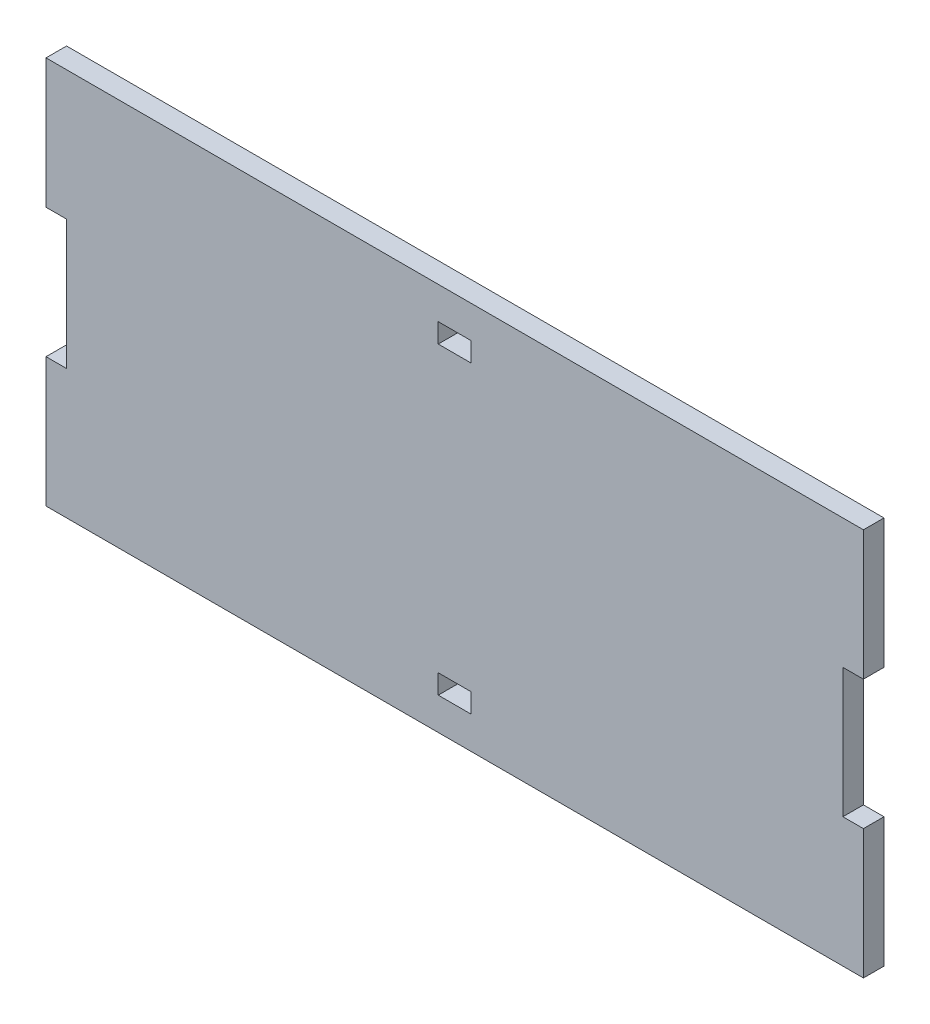
ISO-10303-21;
HEADER;
FILE_DESCRIPTION(('STEP AP214'),'2;1');
FILE_NAME('part.step','',(''),(''),'','','');
FILE_SCHEMA(('AUTOMOTIVE_DESIGN { 1 0 10303 214 1 1 1 1 }'));
ENDSEC;
DATA;
#1=APPLICATION_CONTEXT('core data for automotive mechanical design processes');
#2=APPLICATION_PROTOCOL_DEFINITION('international standard','automotive_design',2000,#1);
#3=PRODUCT_CONTEXT('',#1,'mechanical');
#4=PRODUCT('Part','Part','',(#3));
#5=PRODUCT_RELATED_PRODUCT_CATEGORY('part','',(#4));
#6=PRODUCT_DEFINITION_FORMATION('','',#4);
#7=PRODUCT_DEFINITION_CONTEXT('part definition',#1,'design');
#8=PRODUCT_DEFINITION('design','',#6,#7);
#9=PRODUCT_DEFINITION_SHAPE('','',#8);
#10=(LENGTH_UNIT() NAMED_UNIT(*) SI_UNIT(.MILLI.,.METRE.));
#11=(NAMED_UNIT(*) PLANE_ANGLE_UNIT() SI_UNIT($,.RADIAN.));
#12=(NAMED_UNIT(*) SI_UNIT($,.STERADIAN.) SOLID_ANGLE_UNIT());
#13=UNCERTAINTY_MEASURE_WITH_UNIT(LENGTH_MEASURE(1.E-05),#10,'distance_accuracy_value','');
#14=(GEOMETRIC_REPRESENTATION_CONTEXT(3) GLOBAL_UNCERTAINTY_ASSIGNED_CONTEXT((#13)) GLOBAL_UNIT_ASSIGNED_CONTEXT((#10,
#11,#12)) REPRESENTATION_CONTEXT('',''));
#15=CARTESIAN_POINT('',(0.,0.,0.));
#16=DIRECTION('',(0.,0.,1.));
#17=DIRECTION('',(1.,0.,0.));
#18=AXIS2_PLACEMENT_3D('',#15,#16,#17);
#19=CARTESIAN_POINT('',(0.,0.,3.175));
#20=DIRECTION('',(0.,0.,1.));
#21=DIRECTION('',(1.,0.,0.));
#22=AXIS2_PLACEMENT_3D('',#19,#20,#21);
#23=PLANE('',#22);
#24=DIRECTION('',(0.,-1.,0.));
#25=VECTOR('',#24,1.);
#26=CARTESIAN_POINT('',(0.,0.,3.175));
#27=LINE('',#26,#25);
#28=CARTESIAN_POINT('',(0.,20.,3.175));
#29=VERTEX_POINT('',#28);
#30=CARTESIAN_POINT('',(0.,0.,3.175));
#31=VERTEX_POINT('',#30);
#32=EDGE_CURVE('E237',#29,#31,#27,.T.);
#33=ORIENTED_EDGE('',*,*,#32,.T.);
#34=DIRECTION('',(1.,0.,0.));
#35=VECTOR('',#34,1.);
#36=CARTESIAN_POINT('',(0.,0.,3.175));
#37=LINE('',#36,#35);
#38=CARTESIAN_POINT('',(126.35,0.,3.175));
#39=VERTEX_POINT('',#38);
#40=EDGE_CURVE('E240',#31,#39,#37,.T.);
#41=ORIENTED_EDGE('',*,*,#40,.T.);
#42=DIRECTION('',(0.,1.,0.));
#43=VECTOR('',#42,1.);
#44=CARTESIAN_POINT('',(126.35,0.,3.175));
#45=LINE('',#44,#43);
#46=CARTESIAN_POINT('',(126.35,20.,3.175));
#47=VERTEX_POINT('',#46);
#48=EDGE_CURVE('E243',#39,#47,#45,.T.);
#49=ORIENTED_EDGE('',*,*,#48,.T.);
#50=DIRECTION('',(-1.,0.,0.));
#51=VECTOR('',#50,1.);
#52=CARTESIAN_POINT('',(123.175,20.,3.175));
#53=LINE('',#52,#51);
#54=CARTESIAN_POINT('',(123.175,20.,3.175));
#55=VERTEX_POINT('',#54);
#56=EDGE_CURVE('E245',#47,#55,#53,.T.);
#57=ORIENTED_EDGE('',*,*,#56,.T.);
#58=DIRECTION('',(0.,1.,0.));
#59=VECTOR('',#58,1.);
#60=CARTESIAN_POINT('',(123.175,40.,3.175));
#61=LINE('',#60,#59);
#62=CARTESIAN_POINT('',(123.175,40.,3.175));
#63=VERTEX_POINT('',#62);
#64=EDGE_CURVE('E247',#55,#63,#61,.T.);
#65=ORIENTED_EDGE('',*,*,#64,.T.);
#66=DIRECTION('',(1.,0.,0.));
#67=VECTOR('',#66,1.);
#68=CARTESIAN_POINT('',(126.35,40.,3.175));
#69=LINE('',#68,#67);
#70=CARTESIAN_POINT('',(126.35,40.,3.175));
#71=VERTEX_POINT('',#70);
#72=EDGE_CURVE('E249',#63,#71,#69,.T.);
#73=ORIENTED_EDGE('',*,*,#72,.T.);
#74=DIRECTION('',(0.,1.,0.));
#75=VECTOR('',#74,1.);
#76=CARTESIAN_POINT('',(126.35,40.,3.175));
#77=LINE('',#76,#75);
#78=CARTESIAN_POINT('',(126.35,60.,3.175));
#79=VERTEX_POINT('',#78);
#80=EDGE_CURVE('E251',#71,#79,#77,.T.);
#81=ORIENTED_EDGE('',*,*,#80,.T.);
#82=DIRECTION('',(-1.,0.,0.));
#83=VECTOR('',#82,1.);
#84=CARTESIAN_POINT('',(0.,60.,3.175));
#85=LINE('',#84,#83);
#86=CARTESIAN_POINT('',(0.,60.,3.175));
#87=VERTEX_POINT('',#86);
#88=EDGE_CURVE('E253',#79,#87,#85,.T.);
#89=ORIENTED_EDGE('',*,*,#88,.T.);
#90=DIRECTION('',(0.,-1.,0.));
#91=VECTOR('',#90,1.);
#92=CARTESIAN_POINT('',(0.,40.,3.175));
#93=LINE('',#92,#91);
#94=CARTESIAN_POINT('',(0.,40.,3.175));
#95=VERTEX_POINT('',#94);
#96=EDGE_CURVE('E255',#87,#95,#93,.T.);
#97=ORIENTED_EDGE('',*,*,#96,.T.);
#98=DIRECTION('',(1.,0.,0.));
#99=VECTOR('',#98,1.);
#100=CARTESIAN_POINT('',(0.,40.,3.175));
#101=LINE('',#100,#99);
#102=CARTESIAN_POINT('',(3.175,40.,3.175));
#103=VERTEX_POINT('',#102);
#104=EDGE_CURVE('E257',#95,#103,#101,.T.);
#105=ORIENTED_EDGE('',*,*,#104,.T.);
#106=DIRECTION('',(0.,-1.,0.));
#107=VECTOR('',#106,1.);
#108=CARTESIAN_POINT('',(3.175,40.,3.175));
#109=LINE('',#108,#107);
#110=CARTESIAN_POINT('',(3.175,20.,3.175));
#111=VERTEX_POINT('',#110);
#112=EDGE_CURVE('E259',#103,#111,#109,.T.);
#113=ORIENTED_EDGE('',*,*,#112,.T.);
#114=DIRECTION('',(-1.,0.,0.));
#115=VECTOR('',#114,1.);
#116=CARTESIAN_POINT('',(3.175,20.,3.175));
#117=LINE('',#116,#115);
#118=EDGE_CURVE('E261',#111,#29,#117,.T.);
#119=ORIENTED_EDGE('',*,*,#118,.T.);
#120=EDGE_LOOP('',(#33,#41,#49,#57,#65,#73,#81,#89,#97,#105,#113,#119));
#121=FACE_BOUND('',#120,.T.);
#122=DIRECTION('',(-1.,0.,0.));
#123=VECTOR('',#122,1.);
#124=CARTESIAN_POINT('',(65.725,8.,3.175));
#125=LINE('',#124,#123);
#126=CARTESIAN_POINT('',(65.725,8.,3.175));
#127=VERTEX_POINT('',#126);
#128=CARTESIAN_POINT('',(60.625,8.,3.175));
#129=VERTEX_POINT('',#128);
#130=EDGE_CURVE('E208',#127,#129,#125,.T.);
#131=ORIENTED_EDGE('',*,*,#130,.F.);
#132=DIRECTION('',(0.,1.,0.));
#133=VECTOR('',#132,1.);
#134=CARTESIAN_POINT('',(65.725,8.,3.175));
#135=LINE('',#134,#133);
#136=CARTESIAN_POINT('',(65.725,5.,3.175));
#137=VERTEX_POINT('',#136);
#138=EDGE_CURVE('E206',#137,#127,#135,.T.);
#139=ORIENTED_EDGE('',*,*,#138,.F.);
#140=DIRECTION('',(1.,0.,0.));
#141=VECTOR('',#140,1.);
#142=CARTESIAN_POINT('',(65.725,5.,3.175));
#143=LINE('',#142,#141);
#144=CARTESIAN_POINT('',(60.625,5.,3.175));
#145=VERTEX_POINT('',#144);
#146=EDGE_CURVE('E214',#145,#137,#143,.T.);
#147=ORIENTED_EDGE('',*,*,#146,.F.);
#148=DIRECTION('',(0.,-1.,0.));
#149=VECTOR('',#148,1.);
#150=CARTESIAN_POINT('',(60.625,8.,3.175));
#151=LINE('',#150,#149);
#152=EDGE_CURVE('E211',#129,#145,#151,.T.);
#153=ORIENTED_EDGE('',*,*,#152,.F.);
#154=EDGE_LOOP('',(#131,#139,#147,#153));
#155=FACE_BOUND('',#154,.T.);
#156=DIRECTION('',(-1.,0.,0.));
#157=VECTOR('',#156,1.);
#158=CARTESIAN_POINT('',(65.725,55.,3.175));
#159=LINE('',#158,#157);
#160=CARTESIAN_POINT('',(65.725,55.,3.175));
#161=VERTEX_POINT('',#160);
#162=CARTESIAN_POINT('',(60.625,55.,3.175));
#163=VERTEX_POINT('',#162);
#164=EDGE_CURVE('E178',#161,#163,#159,.T.);
#165=ORIENTED_EDGE('',*,*,#164,.F.);
#166=DIRECTION('',(0.,1.,0.));
#167=VECTOR('',#166,1.);
#168=CARTESIAN_POINT('',(65.725,52.,3.175));
#169=LINE('',#168,#167);
#170=CARTESIAN_POINT('',(65.725,52.,3.175));
#171=VERTEX_POINT('',#170);
#172=EDGE_CURVE('E170',#171,#161,#169,.T.);
#173=ORIENTED_EDGE('',*,*,#172,.F.);
#174=DIRECTION('',(1.,0.,0.));
#175=VECTOR('',#174,1.);
#176=CARTESIAN_POINT('',(65.725,52.,3.175));
#177=LINE('',#176,#175);
#178=CARTESIAN_POINT('',(60.625,52.,3.175));
#179=VERTEX_POINT('',#178);
#180=EDGE_CURVE('E192',#179,#171,#177,.T.);
#181=ORIENTED_EDGE('',*,*,#180,.F.);
#182=DIRECTION('',(0.,-1.,0.));
#183=VECTOR('',#182,1.);
#184=CARTESIAN_POINT('',(60.625,52.,3.175));
#185=LINE('',#184,#183);
#186=EDGE_CURVE('E190',#163,#179,#185,.T.);
#187=ORIENTED_EDGE('',*,*,#186,.F.);
#188=EDGE_LOOP('',(#165,#173,#181,#187));
#189=FACE_BOUND('',#188,.T.);
#190=ADVANCED_FACE('F33',(#121,#155,#189),#23,.T.);
#191=CARTESIAN_POINT('',(0.,0.,0.));
#192=DIRECTION('',(0.,0.,1.));
#193=DIRECTION('',(1.,0.,0.));
#194=AXIS2_PLACEMENT_3D('',#191,#192,#193);
#195=PLANE('',#194);
#196=DIRECTION('',(0.,1.,0.));
#197=VECTOR('',#196,1.);
#198=CARTESIAN_POINT('',(65.725,8.,0.));
#199=LINE('',#198,#197);
#200=CARTESIAN_POINT('',(65.725,5.,0.));
#201=VERTEX_POINT('',#200);
#202=CARTESIAN_POINT('',(65.725,8.,0.));
#203=VERTEX_POINT('',#202);
#204=EDGE_CURVE('E186',#201,#203,#199,.T.);
#205=ORIENTED_EDGE('',*,*,#204,.T.);
#206=DIRECTION('',(-1.,0.,0.));
#207=VECTOR('',#206,1.);
#208=CARTESIAN_POINT('',(65.725,8.,0.));
#209=LINE('',#208,#207);
#210=CARTESIAN_POINT('',(60.625,8.,0.));
#211=VERTEX_POINT('',#210);
#212=EDGE_CURVE('E219',#203,#211,#209,.T.);
#213=ORIENTED_EDGE('',*,*,#212,.T.);
#214=DIRECTION('',(0.,-1.,0.));
#215=VECTOR('',#214,1.);
#216=CARTESIAN_POINT('',(60.625,8.,0.));
#217=LINE('',#216,#215);
#218=CARTESIAN_POINT('',(60.625,5.,0.));
#219=VERTEX_POINT('',#218);
#220=EDGE_CURVE('E222',#211,#219,#217,.T.);
#221=ORIENTED_EDGE('',*,*,#220,.T.);
#222=DIRECTION('',(1.,0.,0.));
#223=VECTOR('',#222,1.);
#224=CARTESIAN_POINT('',(65.725,5.,0.));
#225=LINE('',#224,#223);
#226=EDGE_CURVE('E209',#219,#201,#225,.T.);
#227=ORIENTED_EDGE('',*,*,#226,.T.);
#228=EDGE_LOOP('',(#205,#213,#221,#227));
#229=FACE_BOUND('',#228,.T.);
#230=DIRECTION('',(0.,-1.,0.));
#231=VECTOR('',#230,1.);
#232=CARTESIAN_POINT('',(0.,0.,0.));
#233=LINE('',#232,#231);
#234=CARTESIAN_POINT('',(0.,20.,0.));
#235=VERTEX_POINT('',#234);
#236=CARTESIAN_POINT('',(0.,0.,0.));
#237=VERTEX_POINT('',#236);
#238=EDGE_CURVE('E236',#235,#237,#233,.T.);
#239=ORIENTED_EDGE('',*,*,#238,.F.);
#240=DIRECTION('',(-1.,0.,0.));
#241=VECTOR('',#240,1.);
#242=CARTESIAN_POINT('',(3.175,20.,0.));
#243=LINE('',#242,#241);
#244=CARTESIAN_POINT('',(3.175,20.,0.));
#245=VERTEX_POINT('',#244);
#246=EDGE_CURVE('E241',#245,#235,#243,.T.);
#247=ORIENTED_EDGE('',*,*,#246,.F.);
#248=DIRECTION('',(0.,-1.,0.));
#249=VECTOR('',#248,1.);
#250=CARTESIAN_POINT('',(3.175,40.,0.));
#251=LINE('',#250,#249);
#252=CARTESIAN_POINT('',(3.175,40.,0.));
#253=VERTEX_POINT('',#252);
#254=EDGE_CURVE('E284',#253,#245,#251,.T.);
#255=ORIENTED_EDGE('',*,*,#254,.F.);
#256=DIRECTION('',(1.,0.,0.));
#257=VECTOR('',#256,1.);
#258=CARTESIAN_POINT('',(0.,40.,0.));
#259=LINE('',#258,#257);
#260=CARTESIAN_POINT('',(0.,40.,0.));
#261=VERTEX_POINT('',#260);
#262=EDGE_CURVE('E282',#261,#253,#259,.T.);
#263=ORIENTED_EDGE('',*,*,#262,.F.);
#264=DIRECTION('',(0.,-1.,0.));
#265=VECTOR('',#264,1.);
#266=CARTESIAN_POINT('',(0.,40.,0.));
#267=LINE('',#266,#265);
#268=CARTESIAN_POINT('',(0.,60.,0.));
#269=VERTEX_POINT('',#268);
#270=EDGE_CURVE('E280',#269,#261,#267,.T.);
#271=ORIENTED_EDGE('',*,*,#270,.F.);
#272=DIRECTION('',(-1.,0.,0.));
#273=VECTOR('',#272,1.);
#274=CARTESIAN_POINT('',(0.,60.,0.));
#275=LINE('',#274,#273);
#276=CARTESIAN_POINT('',(126.35,60.,0.));
#277=VERTEX_POINT('',#276);
#278=EDGE_CURVE('E278',#277,#269,#275,.T.);
#279=ORIENTED_EDGE('',*,*,#278,.F.);
#280=DIRECTION('',(0.,1.,0.));
#281=VECTOR('',#280,1.);
#282=CARTESIAN_POINT('',(126.35,40.,0.));
#283=LINE('',#282,#281);
#284=CARTESIAN_POINT('',(126.35,40.,0.));
#285=VERTEX_POINT('',#284);
#286=EDGE_CURVE('E276',#285,#277,#283,.T.);
#287=ORIENTED_EDGE('',*,*,#286,.F.);
#288=DIRECTION('',(1.,0.,0.));
#289=VECTOR('',#288,1.);
#290=CARTESIAN_POINT('',(126.35,40.,0.));
#291=LINE('',#290,#289);
#292=CARTESIAN_POINT('',(123.175,40.,0.));
#293=VERTEX_POINT('',#292);
#294=EDGE_CURVE('E274',#293,#285,#291,.T.);
#295=ORIENTED_EDGE('',*,*,#294,.F.);
#296=DIRECTION('',(0.,1.,0.));
#297=VECTOR('',#296,1.);
#298=CARTESIAN_POINT('',(123.175,40.,0.));
#299=LINE('',#298,#297);
#300=CARTESIAN_POINT('',(123.175,20.,0.));
#301=VERTEX_POINT('',#300);
#302=EDGE_CURVE('E272',#301,#293,#299,.T.);
#303=ORIENTED_EDGE('',*,*,#302,.F.);
#304=DIRECTION('',(-1.,0.,0.));
#305=VECTOR('',#304,1.);
#306=CARTESIAN_POINT('',(123.175,20.,0.));
#307=LINE('',#306,#305);
#308=CARTESIAN_POINT('',(126.35,20.,0.));
#309=VERTEX_POINT('',#308);
#310=EDGE_CURVE('E270',#309,#301,#307,.T.);
#311=ORIENTED_EDGE('',*,*,#310,.F.);
#312=DIRECTION('',(0.,1.,0.));
#313=VECTOR('',#312,1.);
#314=CARTESIAN_POINT('',(126.35,0.,0.));
#315=LINE('',#314,#313);
#316=CARTESIAN_POINT('',(126.35,0.,0.));
#317=VERTEX_POINT('',#316);
#318=EDGE_CURVE('E268',#317,#309,#315,.T.);
#319=ORIENTED_EDGE('',*,*,#318,.F.);
#320=DIRECTION('',(1.,0.,0.));
#321=VECTOR('',#320,1.);
#322=CARTESIAN_POINT('',(0.,0.,0.));
#323=LINE('',#322,#321);
#324=EDGE_CURVE('E266',#237,#317,#323,.T.);
#325=ORIENTED_EDGE('',*,*,#324,.F.);
#326=EDGE_LOOP('',(#239,#247,#255,#263,#271,#279,#287,#295,#303,#311,#319,#325));
#327=FACE_BOUND('',#326,.T.);
#328=DIRECTION('',(0.,1.,0.));
#329=VECTOR('',#328,1.);
#330=CARTESIAN_POINT('',(65.725,52.,0.));
#331=LINE('',#330,#329);
#332=CARTESIAN_POINT('',(65.725,52.,0.));
#333=VERTEX_POINT('',#332);
#334=CARTESIAN_POINT('',(65.725,55.,0.));
#335=VERTEX_POINT('',#334);
#336=EDGE_CURVE('E56',#333,#335,#331,.T.);
#337=ORIENTED_EDGE('',*,*,#336,.T.);
#338=DIRECTION('',(-1.,0.,0.));
#339=VECTOR('',#338,1.);
#340=CARTESIAN_POINT('',(65.725,55.,0.));
#341=LINE('',#340,#339);
#342=CARTESIAN_POINT('',(60.625,55.,0.));
#343=VERTEX_POINT('',#342);
#344=EDGE_CURVE('E185',#335,#343,#341,.T.);
#345=ORIENTED_EDGE('',*,*,#344,.T.);
#346=DIRECTION('',(0.,-1.,0.));
#347=VECTOR('',#346,1.);
#348=CARTESIAN_POINT('',(60.625,52.,0.));
#349=LINE('',#348,#347);
#350=CARTESIAN_POINT('',(60.625,52.,0.));
#351=VERTEX_POINT('',#350);
#352=EDGE_CURVE('E198',#343,#351,#349,.T.);
#353=ORIENTED_EDGE('',*,*,#352,.T.);
#354=DIRECTION('',(1.,0.,0.));
#355=VECTOR('',#354,1.);
#356=CARTESIAN_POINT('',(65.725,52.,0.));
#357=LINE('',#356,#355);
#358=EDGE_CURVE('E179',#351,#333,#357,.T.);
#359=ORIENTED_EDGE('',*,*,#358,.T.);
#360=EDGE_LOOP('',(#337,#345,#353,#359));
#361=FACE_BOUND('',#360,.T.);
#362=ADVANCED_FACE('F326',(#229,#327,#361),#195,.F.);
#363=CARTESIAN_POINT('',(0.,0.,3.175));
#364=DIRECTION('',(1.,0.,0.));
#365=DIRECTION('',(0.,0.,-1.));
#366=AXIS2_PLACEMENT_3D('',#363,#364,#365);
#367=PLANE('',#366);
#368=ORIENTED_EDGE('',*,*,#238,.T.);
#369=DIRECTION('',(0.,0.,-1.));
#370=VECTOR('',#369,1.);
#371=CARTESIAN_POINT('',(0.,0.,3.175));
#372=LINE('',#371,#370);
#373=EDGE_CURVE('E11',#31,#237,#372,.T.);
#374=ORIENTED_EDGE('',*,*,#373,.F.);
#375=ORIENTED_EDGE('',*,*,#32,.F.);
#376=DIRECTION('',(0.,0.,-1.));
#377=VECTOR('',#376,1.);
#378=CARTESIAN_POINT('',(0.,20.,3.175));
#379=LINE('',#378,#377);
#380=EDGE_CURVE('E263',#29,#235,#379,.T.);
#381=ORIENTED_EDGE('',*,*,#380,.T.);
#382=EDGE_LOOP('',(#368,#374,#375,#381));
#383=FACE_BOUND('',#382,.T.);
#384=ADVANCED_FACE('F35',(#383),#367,.F.);
#385=CARTESIAN_POINT('',(0.,0.,3.175));
#386=DIRECTION('',(0.,1.,0.));
#387=DIRECTION('',(0.,0.,1.));
#388=AXIS2_PLACEMENT_3D('',#385,#386,#387);
#389=PLANE('',#388);
#390=ORIENTED_EDGE('',*,*,#324,.T.);
#391=DIRECTION('',(0.,0.,-1.));
#392=VECTOR('',#391,1.);
#393=CARTESIAN_POINT('',(126.35,0.,3.175));
#394=LINE('',#393,#392);
#395=EDGE_CURVE('E41',#39,#317,#394,.T.);
#396=ORIENTED_EDGE('',*,*,#395,.F.);
#397=ORIENTED_EDGE('',*,*,#40,.F.);
#398=ORIENTED_EDGE('',*,*,#373,.T.);
#399=EDGE_LOOP('',(#390,#396,#397,#398));
#400=FACE_BOUND('',#399,.T.);
#401=ADVANCED_FACE('F344',(#400),#389,.F.);
#402=CARTESIAN_POINT('',(126.35,0.,3.175));
#403=DIRECTION('',(-1.,0.,0.));
#404=DIRECTION('',(0.,0.,1.));
#405=AXIS2_PLACEMENT_3D('',#402,#403,#404);
#406=PLANE('',#405);
#407=ORIENTED_EDGE('',*,*,#318,.T.);
#408=DIRECTION('',(0.,0.,-1.));
#409=VECTOR('',#408,1.);
#410=CARTESIAN_POINT('',(126.35,20.,3.175));
#411=LINE('',#410,#409);
#412=EDGE_CURVE('E313',#47,#309,#411,.T.);
#413=ORIENTED_EDGE('',*,*,#412,.F.);
#414=ORIENTED_EDGE('',*,*,#48,.F.);
#415=ORIENTED_EDGE('',*,*,#395,.T.);
#416=EDGE_LOOP('',(#407,#413,#414,#415));
#417=FACE_BOUND('',#416,.T.);
#418=ADVANCED_FACE('F320',(#417),#406,.F.);
#419=CARTESIAN_POINT('',(123.175,20.,3.175));
#420=DIRECTION('',(0.,-1.,0.));
#421=DIRECTION('',(0.,0.,-1.));
#422=AXIS2_PLACEMENT_3D('',#419,#420,#421);
#423=PLANE('',#422);
#424=ORIENTED_EDGE('',*,*,#310,.T.);
#425=DIRECTION('',(0.,0.,-1.));
#426=VECTOR('',#425,1.);
#427=CARTESIAN_POINT('',(123.175,20.,3.175));
#428=LINE('',#427,#426);
#429=EDGE_CURVE('E310',#55,#301,#428,.T.);
#430=ORIENTED_EDGE('',*,*,#429,.F.);
#431=ORIENTED_EDGE('',*,*,#56,.F.);
#432=ORIENTED_EDGE('',*,*,#412,.T.);
#433=EDGE_LOOP('',(#424,#430,#431,#432));
#434=FACE_BOUND('',#433,.T.);
#435=ADVANCED_FACE('F332',(#434),#423,.F.);
#436=CARTESIAN_POINT('',(123.175,40.,3.175));
#437=DIRECTION('',(-1.,0.,0.));
#438=DIRECTION('',(0.,0.,1.));
#439=AXIS2_PLACEMENT_3D('',#436,#437,#438);
#440=PLANE('',#439);
#441=ORIENTED_EDGE('',*,*,#302,.T.);
#442=DIRECTION('',(0.,0.,-1.));
#443=VECTOR('',#442,1.);
#444=CARTESIAN_POINT('',(123.175,40.,3.175));
#445=LINE('',#444,#443);
#446=EDGE_CURVE('E307',#63,#293,#445,.T.);
#447=ORIENTED_EDGE('',*,*,#446,.F.);
#448=ORIENTED_EDGE('',*,*,#64,.F.);
#449=ORIENTED_EDGE('',*,*,#429,.T.);
#450=EDGE_LOOP('',(#441,#447,#448,#449));
#451=FACE_BOUND('',#450,.T.);
#452=ADVANCED_FACE('F336',(#451),#440,.F.);
#453=CARTESIAN_POINT('',(126.35,40.,3.175));
#454=DIRECTION('',(0.,1.,0.));
#455=DIRECTION('',(0.,0.,1.));
#456=AXIS2_PLACEMENT_3D('',#453,#454,#455);
#457=PLANE('',#456);
#458=ORIENTED_EDGE('',*,*,#294,.T.);
#459=DIRECTION('',(0.,0.,-1.));
#460=VECTOR('',#459,1.);
#461=CARTESIAN_POINT('',(126.35,40.,3.175));
#462=LINE('',#461,#460);
#463=EDGE_CURVE('E304',#71,#285,#462,.T.);
#464=ORIENTED_EDGE('',*,*,#463,.F.);
#465=ORIENTED_EDGE('',*,*,#72,.F.);
#466=ORIENTED_EDGE('',*,*,#446,.T.);
#467=EDGE_LOOP('',(#458,#464,#465,#466));
#468=FACE_BOUND('',#467,.T.);
#469=ADVANCED_FACE('F377',(#468),#457,.F.);
#470=CARTESIAN_POINT('',(126.35,40.,3.175));
#471=DIRECTION('',(-1.,0.,0.));
#472=DIRECTION('',(0.,0.,1.));
#473=AXIS2_PLACEMENT_3D('',#470,#471,#472);
#474=PLANE('',#473);
#475=ORIENTED_EDGE('',*,*,#286,.T.);
#476=DIRECTION('',(0.,0.,-1.));
#477=VECTOR('',#476,1.);
#478=CARTESIAN_POINT('',(126.35,60.,3.175));
#479=LINE('',#478,#477);
#480=EDGE_CURVE('E301',#79,#277,#479,.T.);
#481=ORIENTED_EDGE('',*,*,#480,.F.);
#482=ORIENTED_EDGE('',*,*,#80,.F.);
#483=ORIENTED_EDGE('',*,*,#463,.T.);
#484=EDGE_LOOP('',(#475,#481,#482,#483));
#485=FACE_BOUND('',#484,.T.);
#486=ADVANCED_FACE('F375',(#485),#474,.F.);
#487=CARTESIAN_POINT('',(0.,60.,3.175));
#488=DIRECTION('',(0.,-1.,0.));
#489=DIRECTION('',(0.,0.,-1.));
#490=AXIS2_PLACEMENT_3D('',#487,#488,#489);
#491=PLANE('',#490);
#492=ORIENTED_EDGE('',*,*,#278,.T.);
#493=DIRECTION('',(0.,0.,-1.));
#494=VECTOR('',#493,1.);
#495=CARTESIAN_POINT('',(0.,60.,3.175));
#496=LINE('',#495,#494);
#497=EDGE_CURVE('E298',#87,#269,#496,.T.);
#498=ORIENTED_EDGE('',*,*,#497,.F.);
#499=ORIENTED_EDGE('',*,*,#88,.F.);
#500=ORIENTED_EDGE('',*,*,#480,.T.);
#501=EDGE_LOOP('',(#492,#498,#499,#500));
#502=FACE_BOUND('',#501,.T.);
#503=ADVANCED_FACE('F371',(#502),#491,.F.);
#504=CARTESIAN_POINT('',(0.,40.,3.175));
#505=DIRECTION('',(1.,0.,0.));
#506=DIRECTION('',(0.,0.,-1.));
#507=AXIS2_PLACEMENT_3D('',#504,#505,#506);
#508=PLANE('',#507);
#509=ORIENTED_EDGE('',*,*,#270,.T.);
#510=DIRECTION('',(0.,0.,-1.));
#511=VECTOR('',#510,1.);
#512=CARTESIAN_POINT('',(0.,40.,3.175));
#513=LINE('',#512,#511);
#514=EDGE_CURVE('E295',#95,#261,#513,.T.);
#515=ORIENTED_EDGE('',*,*,#514,.F.);
#516=ORIENTED_EDGE('',*,*,#96,.F.);
#517=ORIENTED_EDGE('',*,*,#497,.T.);
#518=EDGE_LOOP('',(#509,#515,#516,#517));
#519=FACE_BOUND('',#518,.T.);
#520=ADVANCED_FACE('F366',(#519),#508,.F.);
#521=CARTESIAN_POINT('',(0.,40.,3.175));
#522=DIRECTION('',(0.,1.,0.));
#523=DIRECTION('',(-1.,0.,0.));
#524=AXIS2_PLACEMENT_3D('',#521,#522,#523);
#525=PLANE('',#524);
#526=ORIENTED_EDGE('',*,*,#262,.T.);
#527=DIRECTION('',(0.,0.,-1.));
#528=VECTOR('',#527,1.);
#529=CARTESIAN_POINT('',(3.175,40.,3.175));
#530=LINE('',#529,#528);
#531=EDGE_CURVE('E292',#103,#253,#530,.T.);
#532=ORIENTED_EDGE('',*,*,#531,.F.);
#533=ORIENTED_EDGE('',*,*,#104,.F.);
#534=ORIENTED_EDGE('',*,*,#514,.T.);
#535=EDGE_LOOP('',(#526,#532,#533,#534));
#536=FACE_BOUND('',#535,.T.);
#537=ADVANCED_FACE('F360',(#536),#525,.F.);
#538=CARTESIAN_POINT('',(3.175,40.,3.175));
#539=DIRECTION('',(1.,0.,0.));
#540=DIRECTION('',(0.,0.,-1.));
#541=AXIS2_PLACEMENT_3D('',#538,#539,#540);
#542=PLANE('',#541);
#543=ORIENTED_EDGE('',*,*,#254,.T.);
#544=DIRECTION('',(0.,0.,-1.));
#545=VECTOR('',#544,1.);
#546=CARTESIAN_POINT('',(3.175,20.,3.175));
#547=LINE('',#546,#545);
#548=EDGE_CURVE('E289',#111,#245,#547,.T.);
#549=ORIENTED_EDGE('',*,*,#548,.F.);
#550=ORIENTED_EDGE('',*,*,#112,.F.);
#551=ORIENTED_EDGE('',*,*,#531,.T.);
#552=EDGE_LOOP('',(#543,#549,#550,#551));
#553=FACE_BOUND('',#552,.T.);
#554=ADVANCED_FACE('F356',(#553),#542,.F.);
#555=CARTESIAN_POINT('',(3.175,20.,3.175));
#556=DIRECTION('',(0.,-1.,0.));
#557=DIRECTION('',(1.,0.,0.));
#558=AXIS2_PLACEMENT_3D('',#555,#556,#557);
#559=PLANE('',#558);
#560=ORIENTED_EDGE('',*,*,#246,.T.);
#561=ORIENTED_EDGE('',*,*,#380,.F.);
#562=ORIENTED_EDGE('',*,*,#118,.F.);
#563=ORIENTED_EDGE('',*,*,#548,.T.);
#564=EDGE_LOOP('',(#560,#561,#562,#563));
#565=FACE_BOUND('',#564,.T.);
#566=ADVANCED_FACE('F351',(#565),#559,.F.);
#567=CARTESIAN_POINT('',(65.725,8.,3.175));
#568=DIRECTION('',(-1.,0.,0.));
#569=DIRECTION('',(0.,0.,1.));
#570=AXIS2_PLACEMENT_3D('',#567,#568,#569);
#571=PLANE('',#570);
#572=ORIENTED_EDGE('',*,*,#204,.F.);
#573=DIRECTION('',(0.,0.,-1.));
#574=VECTOR('',#573,1.);
#575=CARTESIAN_POINT('',(65.725,5.,3.175));
#576=LINE('',#575,#574);
#577=EDGE_CURVE('E216',#137,#201,#576,.T.);
#578=ORIENTED_EDGE('',*,*,#577,.F.);
#579=ORIENTED_EDGE('',*,*,#138,.T.);
#580=DIRECTION('',(0.,0.,-1.));
#581=VECTOR('',#580,1.);
#582=CARTESIAN_POINT('',(65.725,8.,3.175));
#583=LINE('',#582,#581);
#584=EDGE_CURVE('E233',#127,#203,#583,.T.);
#585=ORIENTED_EDGE('',*,*,#584,.T.);
#586=EDGE_LOOP('',(#572,#578,#579,#585));
#587=FACE_BOUND('',#586,.T.);
#588=ADVANCED_FACE('F394',(#587),#571,.T.);
#589=CARTESIAN_POINT('',(65.725,8.,3.175));
#590=DIRECTION('',(0.,-1.,0.));
#591=DIRECTION('',(0.,0.,-1.));
#592=AXIS2_PLACEMENT_3D('',#589,#590,#591);
#593=PLANE('',#592);
#594=ORIENTED_EDGE('',*,*,#212,.F.);
#595=ORIENTED_EDGE('',*,*,#584,.F.);
#596=ORIENTED_EDGE('',*,*,#130,.T.);
#597=DIRECTION('',(0.,0.,-1.));
#598=VECTOR('',#597,1.);
#599=CARTESIAN_POINT('',(60.625,8.,3.175));
#600=LINE('',#599,#598);
#601=EDGE_CURVE('E231',#129,#211,#600,.T.);
#602=ORIENTED_EDGE('',*,*,#601,.T.);
#603=EDGE_LOOP('',(#594,#595,#596,#602));
#604=FACE_BOUND('',#603,.T.);
#605=ADVANCED_FACE('F432',(#604),#593,.T.);
#606=CARTESIAN_POINT('',(60.625,8.,3.175));
#607=DIRECTION('',(1.,0.,0.));
#608=DIRECTION('',(0.,0.,-1.));
#609=AXIS2_PLACEMENT_3D('',#606,#607,#608);
#610=PLANE('',#609);
#611=ORIENTED_EDGE('',*,*,#220,.F.);
#612=ORIENTED_EDGE('',*,*,#601,.F.);
#613=ORIENTED_EDGE('',*,*,#152,.T.);
#614=DIRECTION('',(0.,0.,-1.));
#615=VECTOR('',#614,1.);
#616=CARTESIAN_POINT('',(60.625,5.,3.175));
#617=LINE('',#616,#615);
#618=EDGE_CURVE('E229',#145,#219,#617,.T.);
#619=ORIENTED_EDGE('',*,*,#618,.T.);
#620=EDGE_LOOP('',(#611,#612,#613,#619));
#621=FACE_BOUND('',#620,.T.);
#622=ADVANCED_FACE('F439',(#621),#610,.T.);
#623=CARTESIAN_POINT('',(65.725,5.,3.175));
#624=DIRECTION('',(0.,1.,0.));
#625=DIRECTION('',(0.,0.,1.));
#626=AXIS2_PLACEMENT_3D('',#623,#624,#625);
#627=PLANE('',#626);
#628=ORIENTED_EDGE('',*,*,#226,.F.);
#629=ORIENTED_EDGE('',*,*,#618,.F.);
#630=ORIENTED_EDGE('',*,*,#146,.T.);
#631=ORIENTED_EDGE('',*,*,#577,.T.);
#632=EDGE_LOOP('',(#628,#629,#630,#631));
#633=FACE_BOUND('',#632,.T.);
#634=ADVANCED_FACE('F446',(#633),#627,.T.);
#635=CARTESIAN_POINT('',(65.725,52.,3.175));
#636=DIRECTION('',(-1.,0.,0.));
#637=DIRECTION('',(0.,0.,1.));
#638=AXIS2_PLACEMENT_3D('',#635,#636,#637);
#639=PLANE('',#638);
#640=ORIENTED_EDGE('',*,*,#336,.F.);
#641=DIRECTION('',(0.,0.,-1.));
#642=VECTOR('',#641,1.);
#643=CARTESIAN_POINT('',(65.725,52.,3.175));
#644=LINE('',#643,#642);
#645=EDGE_CURVE('E174',#171,#333,#644,.T.);
#646=ORIENTED_EDGE('',*,*,#645,.F.);
#647=ORIENTED_EDGE('',*,*,#172,.T.);
#648=DIRECTION('',(0.,0.,-1.));
#649=VECTOR('',#648,1.);
#650=CARTESIAN_POINT('',(65.725,55.,3.175));
#651=LINE('',#650,#649);
#652=EDGE_CURVE('E173',#161,#335,#651,.T.);
#653=ORIENTED_EDGE('',*,*,#652,.T.);
#654=EDGE_LOOP('',(#640,#646,#647,#653));
#655=FACE_BOUND('',#654,.T.);
#656=ADVANCED_FACE('F172',(#655),#639,.T.);
#657=CARTESIAN_POINT('',(65.725,55.,3.175));
#658=DIRECTION('',(0.,-1.,0.));
#659=DIRECTION('',(0.,0.,-1.));
#660=AXIS2_PLACEMENT_3D('',#657,#658,#659);
#661=PLANE('',#660);
#662=ORIENTED_EDGE('',*,*,#344,.F.);
#663=ORIENTED_EDGE('',*,*,#652,.F.);
#664=ORIENTED_EDGE('',*,*,#164,.T.);
#665=DIRECTION('',(0.,0.,-1.));
#666=VECTOR('',#665,1.);
#667=CARTESIAN_POINT('',(60.625,55.,3.175));
#668=LINE('',#667,#666);
#669=EDGE_CURVE('E187',#163,#343,#668,.T.);
#670=ORIENTED_EDGE('',*,*,#669,.T.);
#671=EDGE_LOOP('',(#662,#663,#664,#670));
#672=FACE_BOUND('',#671,.T.);
#673=ADVANCED_FACE('F182',(#672),#661,.T.);
#674=CARTESIAN_POINT('',(60.625,52.,3.175));
#675=DIRECTION('',(1.,0.,0.));
#676=DIRECTION('',(0.,0.,-1.));
#677=AXIS2_PLACEMENT_3D('',#674,#675,#676);
#678=PLANE('',#677);
#679=ORIENTED_EDGE('',*,*,#352,.F.);
#680=ORIENTED_EDGE('',*,*,#669,.F.);
#681=ORIENTED_EDGE('',*,*,#186,.T.);
#682=DIRECTION('',(0.,0.,-1.));
#683=VECTOR('',#682,1.);
#684=CARTESIAN_POINT('',(60.625,52.,3.175));
#685=LINE('',#684,#683);
#686=EDGE_CURVE('E48',#179,#351,#685,.T.);
#687=ORIENTED_EDGE('',*,*,#686,.T.);
#688=EDGE_LOOP('',(#679,#680,#681,#687));
#689=FACE_BOUND('',#688,.T.);
#690=ADVANCED_FACE('F467',(#689),#678,.T.);
#691=CARTESIAN_POINT('',(65.725,52.,3.175));
#692=DIRECTION('',(0.,1.,0.));
#693=DIRECTION('',(0.,0.,1.));
#694=AXIS2_PLACEMENT_3D('',#691,#692,#693);
#695=PLANE('',#694);
#696=ORIENTED_EDGE('',*,*,#358,.F.);
#697=ORIENTED_EDGE('',*,*,#686,.F.);
#698=ORIENTED_EDGE('',*,*,#180,.T.);
#699=ORIENTED_EDGE('',*,*,#645,.T.);
#700=EDGE_LOOP('',(#696,#697,#698,#699));
#701=FACE_BOUND('',#700,.T.);
#702=ADVANCED_FACE('F474',(#701),#695,.T.);
#703=CLOSED_SHELL('',(#190,#362,#384,#401,#418,#435,#452,#469,#486,#503,#520,#537,#554,#566,
#588,#605,#622,#634,#656,#673,#690,#702));
#704=MANIFOLD_SOLID_BREP('B2',#703);
#705=ADVANCED_BREP_SHAPE_REPRESENTATION('',(#18,#704),#14);
#706=SHAPE_DEFINITION_REPRESENTATION(#9,#705);
ENDSEC;
END-ISO-10303-21;
